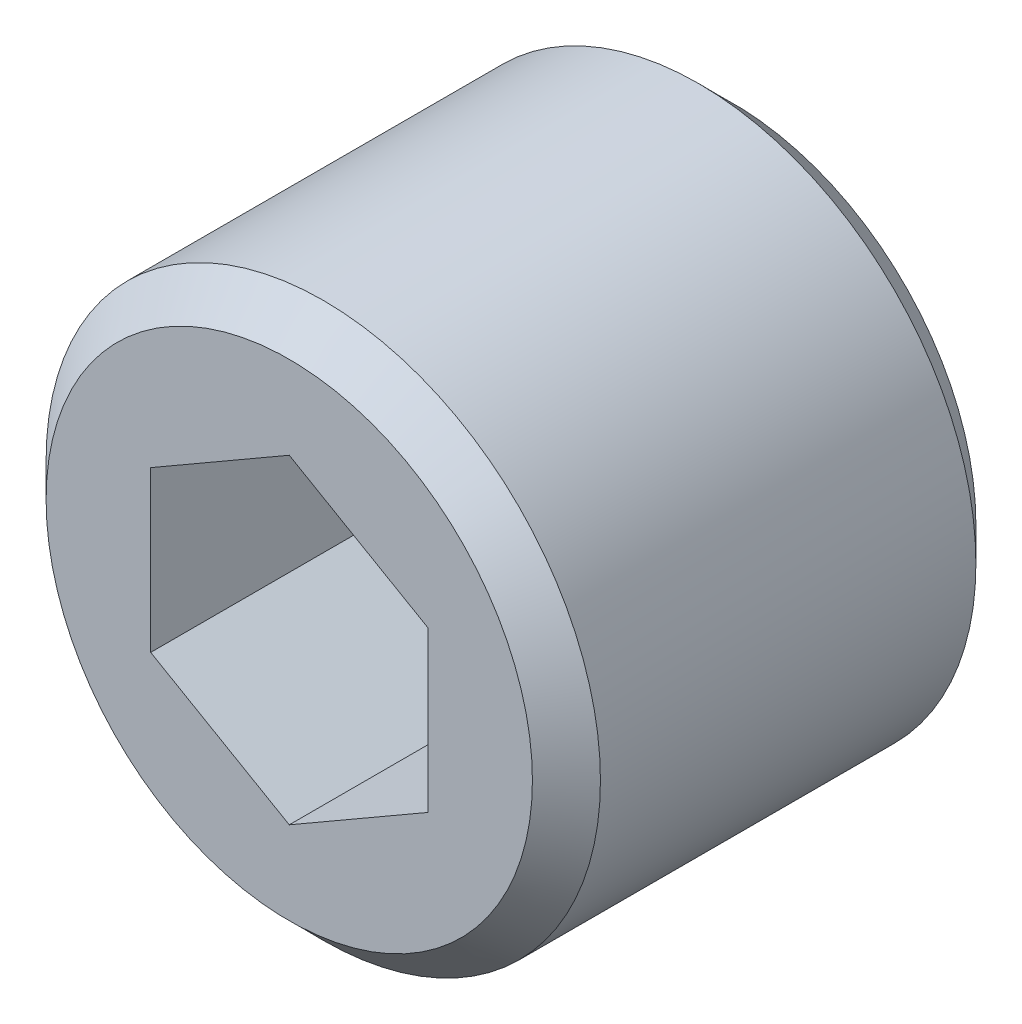
ISO-10303-21;
HEADER;
FILE_DESCRIPTION(('STEP AP214'),'2;1');
FILE_NAME('part.step','',(''),(''),'','','');
FILE_SCHEMA(('AUTOMOTIVE_DESIGN { 1 0 10303 214 1 1 1 1 }'));
ENDSEC;
DATA;
#1=APPLICATION_CONTEXT('core data for automotive mechanical design processes');
#2=APPLICATION_PROTOCOL_DEFINITION('international standard','automotive_design',2000,#1);
#3=PRODUCT_CONTEXT('',#1,'mechanical');
#4=PRODUCT('Part','Part','',(#3));
#5=PRODUCT_RELATED_PRODUCT_CATEGORY('part','',(#4));
#6=PRODUCT_DEFINITION_FORMATION('','',#4);
#7=PRODUCT_DEFINITION_CONTEXT('part definition',#1,'design');
#8=PRODUCT_DEFINITION('design','',#6,#7);
#9=PRODUCT_DEFINITION_SHAPE('','',#8);
#10=(LENGTH_UNIT() NAMED_UNIT(*) SI_UNIT(.MILLI.,.METRE.));
#11=(NAMED_UNIT(*) PLANE_ANGLE_UNIT() SI_UNIT($,.RADIAN.));
#12=(NAMED_UNIT(*) SI_UNIT($,.STERADIAN.) SOLID_ANGLE_UNIT());
#13=UNCERTAINTY_MEASURE_WITH_UNIT(LENGTH_MEASURE(1.E-05),#10,'distance_accuracy_value','');
#14=(GEOMETRIC_REPRESENTATION_CONTEXT(3) GLOBAL_UNCERTAINTY_ASSIGNED_CONTEXT((#13)) GLOBAL_UNIT_ASSIGNED_CONTEXT((#10,
#11,#12)) REPRESENTATION_CONTEXT('',''));
#15=CARTESIAN_POINT('',(0.,0.,0.));
#16=DIRECTION('',(0.,0.,1.));
#17=DIRECTION('',(1.,0.,0.));
#18=AXIS2_PLACEMENT_3D('',#15,#16,#17);
#19=CARTESIAN_POINT('',(0.,0.,8.));
#20=DIRECTION('',(0.,0.,-1.));
#21=DIRECTION('',(-1.,0.,0.));
#22=AXIS2_PLACEMENT_3D('',#19,#20,#21);
#23=PLANE('',#22);
#24=CARTESIAN_POINT('',(0.,0.,8.));
#25=DIRECTION('',(0.,0.,1.));
#26=DIRECTION('',(1.,0.,0.));
#27=AXIS2_PLACEMENT_3D('',#24,#25,#26);
#28=CIRCLE('',#27,4.3865);
#29=CARTESIAN_POINT('',(4.3865,0.,8.));
#30=VERTEX_POINT('',#29);
#31=EDGE_CURVE('E143',#30,#30,#28,.T.);
#32=ORIENTED_EDGE('',*,*,#31,.T.);
#33=EDGE_LOOP('',(#32));
#34=FACE_BOUND('',#33,.T.);
#35=DIRECTION('',(-0.866025403784439,-0.5,0.));
#36=VECTOR('',#35,1.);
#37=CARTESIAN_POINT('',(0.,2.88675134594813,8.));
#38=LINE('',#37,#36);
#39=CARTESIAN_POINT('',(0.,2.88675134594813,8.));
#40=VERTEX_POINT('',#39);
#41=CARTESIAN_POINT('',(-2.5,1.44337567297406,8.));
#42=VERTEX_POINT('',#41);
#43=EDGE_CURVE('E111',#40,#42,#38,.T.);
#44=ORIENTED_EDGE('',*,*,#43,.F.);
#45=DIRECTION('',(-0.866025403784439,0.5,0.));
#46=VECTOR('',#45,1.);
#47=CARTESIAN_POINT('',(2.5,1.44337567297406,8.));
#48=LINE('',#47,#46);
#49=CARTESIAN_POINT('',(2.5,1.44337567297406,8.));
#50=VERTEX_POINT('',#49);
#51=EDGE_CURVE('E123',#50,#40,#48,.T.);
#52=ORIENTED_EDGE('',*,*,#51,.F.);
#53=DIRECTION('',(0.,1.,0.));
#54=VECTOR('',#53,1.);
#55=CARTESIAN_POINT('',(2.5,-1.44337567297406,8.));
#56=LINE('',#55,#54);
#57=CARTESIAN_POINT('',(2.5,-1.44337567297406,8.));
#58=VERTEX_POINT('',#57);
#59=EDGE_CURVE('E117',#58,#50,#56,.T.);
#60=ORIENTED_EDGE('',*,*,#59,.F.);
#61=DIRECTION('',(0.866025403784439,0.5,0.));
#62=VECTOR('',#61,1.);
#63=CARTESIAN_POINT('',(0.,-2.88675134594813,8.));
#64=LINE('',#63,#62);
#65=CARTESIAN_POINT('',(0.,-2.88675134594813,8.));
#66=VERTEX_POINT('',#65);
#67=EDGE_CURVE('E115',#66,#58,#64,.T.);
#68=ORIENTED_EDGE('',*,*,#67,.F.);
#69=DIRECTION('',(0.866025403784439,-0.5,0.));
#70=VECTOR('',#69,1.);
#71=CARTESIAN_POINT('',(-2.5,-1.44337567297406,8.));
#72=LINE('',#71,#70);
#73=CARTESIAN_POINT('',(-2.5,-1.44337567297406,8.));
#74=VERTEX_POINT('',#73);
#75=EDGE_CURVE('E96',#74,#66,#72,.T.);
#76=ORIENTED_EDGE('',*,*,#75,.F.);
#77=DIRECTION('',(0.,-1.,0.));
#78=VECTOR('',#77,1.);
#79=CARTESIAN_POINT('',(-2.5,1.44337567297406,8.));
#80=LINE('',#79,#78);
#81=EDGE_CURVE('E105',#42,#74,#80,.T.);
#82=ORIENTED_EDGE('',*,*,#81,.F.);
#83=EDGE_LOOP('',(#44,#52,#60,#68,#76,#82));
#84=FACE_BOUND('',#83,.T.);
#85=ADVANCED_FACE('F37',(#34,#84),#23,.F.);
#86=CARTESIAN_POINT('',(0.,0.,7.3865));
#87=DIRECTION('',(0.,0.,-1.));
#88=DIRECTION('',(-1.,0.,0.));
#89=AXIS2_PLACEMENT_3D('',#86,#87,#88);
#90=CONICAL_SURFACE('',#89,5.,0.785398163397448);
#91=ORIENTED_EDGE('',*,*,#31,.F.);
#92=EDGE_LOOP('',(#91));
#93=FACE_BOUND('',#92,.T.);
#94=CARTESIAN_POINT('',(0.,0.,7.3865));
#95=DIRECTION('',(0.,0.,1.));
#96=DIRECTION('',(1.,0.,0.));
#97=AXIS2_PLACEMENT_3D('',#94,#95,#96);
#98=CIRCLE('',#97,5.);
#99=CARTESIAN_POINT('',(5.,0.,7.3865));
#100=VERTEX_POINT('',#99);
#101=EDGE_CURVE('E140',#100,#100,#98,.T.);
#102=ORIENTED_EDGE('',*,*,#101,.T.);
#103=EDGE_LOOP('',(#102));
#104=FACE_BOUND('',#103,.T.);
#105=ADVANCED_FACE('F205',(#93,#104),#90,.T.);
#106=CARTESIAN_POINT('',(0.,0.,0.));
#107=DIRECTION('',(0.,0.,1.));
#108=DIRECTION('',(1.,0.,0.));
#109=AXIS2_PLACEMENT_3D('',#106,#107,#108);
#110=CYLINDRICAL_SURFACE('',#109,5.);
#111=ORIENTED_EDGE('',*,*,#101,.F.);
#112=EDGE_LOOP('',(#111));
#113=FACE_BOUND('',#112,.T.);
#114=CARTESIAN_POINT('',(0.,0.,0.6135));
#115=DIRECTION('',(0.,0.,1.));
#116=DIRECTION('',(1.,0.,0.));
#117=AXIS2_PLACEMENT_3D('',#114,#115,#116);
#118=CIRCLE('',#117,5.);
#119=CARTESIAN_POINT('',(5.,0.,0.6135));
#120=VERTEX_POINT('',#119);
#121=EDGE_CURVE('E137',#120,#120,#118,.T.);
#122=ORIENTED_EDGE('',*,*,#121,.T.);
#123=EDGE_LOOP('',(#122));
#124=FACE_BOUND('',#123,.T.);
#125=ADVANCED_FACE('F210',(#113,#124),#110,.T.);
#126=CARTESIAN_POINT('',(0.,0.,0.));
#127=DIRECTION('',(0.,0.,1.));
#128=DIRECTION('',(1.,0.,0.));
#129=AXIS2_PLACEMENT_3D('',#126,#127,#128);
#130=CONICAL_SURFACE('',#129,4.3865,0.785398163397448);
#131=ORIENTED_EDGE('',*,*,#121,.F.);
#132=EDGE_LOOP('',(#131));
#133=FACE_BOUND('',#132,.T.);
#134=CARTESIAN_POINT('',(0.,0.,0.));
#135=DIRECTION('',(0.,0.,1.));
#136=DIRECTION('',(1.,0.,0.));
#137=AXIS2_PLACEMENT_3D('',#134,#135,#136);
#138=CIRCLE('',#137,4.3865);
#139=CARTESIAN_POINT('',(4.3865,0.,0.));
#140=VERTEX_POINT('',#139);
#141=EDGE_CURVE('E128',#140,#140,#138,.T.);
#142=ORIENTED_EDGE('',*,*,#141,.T.);
#143=EDGE_LOOP('',(#142));
#144=FACE_BOUND('',#143,.T.);
#145=ADVANCED_FACE('F218',(#133,#144),#130,.T.);
#146=CARTESIAN_POINT('',(0.,4.3865,0.));
#147=DIRECTION('',(0.,0.,1.));
#148=DIRECTION('',(1.,0.,0.));
#149=AXIS2_PLACEMENT_3D('',#146,#147,#148);
#150=PLANE('',#149);
#151=ORIENTED_EDGE('',*,*,#141,.F.);
#152=EDGE_LOOP('',(#151));
#153=FACE_BOUND('',#152,.T.);
#154=ADVANCED_FACE('F164',(#153),#150,.F.);
#155=CARTESIAN_POINT('',(0.,2.88675134594813,2.));
#156=DIRECTION('',(-0.5,0.866025403784439,0.));
#157=DIRECTION('',(-0.866025403784439,-0.5,0.));
#158=AXIS2_PLACEMENT_3D('',#155,#156,#157);
#159=PLANE('',#158);
#160=CARTESIAN_POINT('',(0.000200000000000067,2.88686681600197,3.71139153607169));
#161=CARTESIAN_POINT('',(-0.109663234734871,2.82343724785375,3.67475549182021));
#162=CARTESIAN_POINT('',(-0.220474799896526,2.75946016087834,3.64143609067764));
#163=CARTESIAN_POINT('',(-0.44401683346605,2.63039810762178,3.58327615727044));
#164=CARTESIAN_POINT('',(-0.556751274528388,2.5653108477275,3.55845620086032));
#165=CARTESIAN_POINT('',(-0.780822993875269,2.43594298024479,3.51981952315364));
#166=CARTESIAN_POINT('',(-0.892125791767377,2.37168227992023,3.50574566789822));
#167=CARTESIAN_POINT('',(-1.11525522746833,2.24285844015415,3.48894302406534));
#168=CARTESIAN_POINT('',(-1.22708105401423,2.17829576909552,3.48620032291621));
#169=CARTESIAN_POINT('',(-1.43604197555152,2.05765212479586,3.49189963172064));
#170=CARTESIAN_POINT('',(-1.53320831755773,2.0015531110824,3.49894226609445));
#171=CARTESIAN_POINT('',(-1.726907949711,1.88972057631678,3.52126529083753));
#172=CARTESIAN_POINT('',(-1.82344056965973,1.8339874422038,3.53655331015285));
#173=CARTESIAN_POINT('',(-2.01753972174048,1.7219242445005,3.57477296555701));
#174=CARTESIAN_POINT('',(-2.11508168178214,1.66560836761316,3.5978666478381));
#175=CARTESIAN_POINT('',(-2.30871060807609,1.55381665489446,3.6502805282905));
#176=CARTESIAN_POINT('',(-2.40480005588618,1.49833938633502,3.67958840733713));
#177=CARTESIAN_POINT('',(-2.5002,1.44326020292023,3.71139153607169));
#178=B_SPLINE_CURVE_WITH_KNOTS('',3,(#160,#161,#162,#163,#164,#165,#166,#167,#168,#169,#170,
#171,#172,#173,#174,#175,#176,#177),.UNSPECIFIED.,.F.,.F.,(4,2,2,2,2,2,2,2,4),(0.,
0.396285827362227,0.793524330152051,1.18093086852114,1.56786160134475,1.90479741793733,
2.24204551660463,2.58677531536756,2.93082800105256),.UNSPECIFIED.);
#179=CARTESIAN_POINT('',(0.,2.88675134594813,3.71132486540519));
#180=VERTEX_POINT('',#179);
#181=CARTESIAN_POINT('',(-2.5,1.44337567297406,3.71132486540519));
#182=VERTEX_POINT('',#181);
#183=EDGE_CURVE('E11',#180,#182,#178,.T.);
#184=ORIENTED_EDGE('',*,*,#183,.F.);
#185=DIRECTION('',(0.,0.,1.));
#186=VECTOR('',#185,1.);
#187=CARTESIAN_POINT('',(0.,2.88675134594813,2.));
#188=LINE('',#187,#186);
#189=EDGE_CURVE('E126',#180,#40,#188,.T.);
#190=ORIENTED_EDGE('',*,*,#189,.T.);
#191=ORIENTED_EDGE('',*,*,#43,.T.);
#192=DIRECTION('',(0.,0.,1.));
#193=VECTOR('',#192,1.);
#194=CARTESIAN_POINT('',(-2.5,1.44337567297406,2.));
#195=LINE('',#194,#193);
#196=EDGE_CURVE('E102',#182,#42,#195,.T.);
#197=ORIENTED_EDGE('',*,*,#196,.F.);
#198=EDGE_LOOP('',(#184,#190,#191,#197));
#199=FACE_BOUND('',#198,.T.);
#200=ADVANCED_FACE('F162',(#199),#159,.F.);
#201=CARTESIAN_POINT('',(2.5,1.44337567297406,2.));
#202=DIRECTION('',(0.5,0.866025403784439,0.));
#203=DIRECTION('',(-0.866025403784439,0.5,0.));
#204=AXIS2_PLACEMENT_3D('',#201,#202,#203);
#205=PLANE('',#204);
#206=CARTESIAN_POINT('',(2.5002,1.44326020292023,3.71139153607169));
#207=CARTESIAN_POINT('',(2.39033676526513,1.50668977106845,3.67475549182021));
#208=CARTESIAN_POINT('',(2.27952520010347,1.57066685804385,3.64143609067764));
#209=CARTESIAN_POINT('',(2.05598316653395,1.69972891130041,3.58327615727044));
#210=CARTESIAN_POINT('',(1.94324872547161,1.7648161711947,3.55845620086032));
#211=CARTESIAN_POINT('',(1.71917700612473,1.8941840386774,3.51981952315364));
#212=CARTESIAN_POINT('',(1.60787420823262,1.95844473900197,3.50574566789822));
#213=CARTESIAN_POINT('',(1.38474477253167,2.08726857876804,3.48894302406534));
#214=CARTESIAN_POINT('',(1.27291894598577,2.15183124982667,3.48620032291621));
#215=CARTESIAN_POINT('',(1.06395802444848,2.27247489412634,3.49189963172064));
#216=CARTESIAN_POINT('',(0.966791682442269,2.32857390783979,3.49894226609445));
#217=CARTESIAN_POINT('',(0.773092050288998,2.44040644260542,3.52126529083753));
#218=CARTESIAN_POINT('',(0.676559430340268,2.4961395767184,3.53655331015285));
#219=CARTESIAN_POINT('',(0.482460278259524,2.60820277442169,3.57477296555701));
#220=CARTESIAN_POINT('',(0.38491831821786,2.66451865130903,3.5978666478381));
#221=CARTESIAN_POINT('',(0.191289391923915,2.77631036402774,3.6502805282905));
#222=CARTESIAN_POINT('',(0.0951999441138242,2.83178763258717,3.67958840733713));
#223=CARTESIAN_POINT('',(-0.000199999999999825,2.88686681600197,3.71139153607169));
#224=B_SPLINE_CURVE_WITH_KNOTS('',3,(#206,#207,#208,#209,#210,#211,#212,#213,#214,#215,#216,
#217,#218,#219,#220,#221,#222,#223),.UNSPECIFIED.,.F.,.F.,(4,2,2,2,2,2,2,2,4),(0.,
0.396285827362227,0.793524330152051,1.18093086852114,1.56786160134475,1.90479741793733,
2.24204551660463,2.58677531536756,2.93082800105256),.UNSPECIFIED.);
#225=CARTESIAN_POINT('',(2.5,1.44337567297406,3.71132486540519));
#226=VERTEX_POINT('',#225);
#227=EDGE_CURVE('E49',#226,#180,#224,.T.);
#228=ORIENTED_EDGE('',*,*,#227,.F.);
#229=DIRECTION('',(0.,0.,1.));
#230=VECTOR('',#229,1.);
#231=CARTESIAN_POINT('',(2.5,1.44337567297406,2.));
#232=LINE('',#231,#230);
#233=EDGE_CURVE('E129',#226,#50,#232,.T.);
#234=ORIENTED_EDGE('',*,*,#233,.T.);
#235=ORIENTED_EDGE('',*,*,#51,.T.);
#236=ORIENTED_EDGE('',*,*,#189,.F.);
#237=EDGE_LOOP('',(#228,#234,#235,#236));
#238=FACE_BOUND('',#237,.T.);
#239=ADVANCED_FACE('F187',(#238),#205,.F.);
#240=CARTESIAN_POINT('',(2.5,-1.44337567297406,2.));
#241=DIRECTION('',(1.,0.,0.));
#242=DIRECTION('',(0.,0.,-1.));
#243=AXIS2_PLACEMENT_3D('',#240,#241,#242);
#244=PLANE('',#243);
#245=CARTESIAN_POINT('',(2.5,-3.80354536274311,4.6725190097687));
#246=CARTESIAN_POINT('',(2.5,-3.69490769832015,4.62012023042167));
#247=CARTESIAN_POINT('',(2.5,-3.58601249619524,4.56824581898817));
#248=CARTESIAN_POINT('',(2.5,-3.36756967184562,4.46584239469188));
#249=CARTESIAN_POINT('',(2.5,-3.2580219427232,4.4153136101271));
#250=CARTESIAN_POINT('',(2.5,-3.03753650963653,4.31562808504963));
#251=CARTESIAN_POINT('',(2.5,-2.92659442987774,4.26648098792461));
#252=CARTESIAN_POINT('',(2.5,-2.7038011769608,4.17030036779373));
#253=CARTESIAN_POINT('',(2.5,-2.59195004950777,4.12326673929366));
#254=CARTESIAN_POINT('',(2.5,-2.36393185858999,4.03056111042707));
#255=CARTESIAN_POINT('',(2.5,-2.24773301175535,3.98496683977699));
#256=CARTESIAN_POINT('',(2.5,-2.01394925265267,3.89741057847115));
#257=CARTESIAN_POINT('',(2.5,-1.89636418294698,3.85544900499669));
#258=CARTESIAN_POINT('',(2.5,-1.6598655692674,3.7763133461035));
#259=CARTESIAN_POINT('',(2.5,-1.54095552400517,3.73912891396282));
#260=CARTESIAN_POINT('',(2.5,-1.30143267945433,3.6707883675403));
#261=CARTESIAN_POINT('',(2.5,-1.1808204524229,3.63963027673055));
#262=CARTESIAN_POINT('',(2.5,-0.938435603689883,3.5850354250525));
#263=CARTESIAN_POINT('',(2.5,-0.816671313996666,3.56156237346552));
#264=CARTESIAN_POINT('',(2.5,-0.571709789783548,3.52372921743801));
#265=CARTESIAN_POINT('',(2.5,-0.448512677134953,3.50936834363467));
#266=CARTESIAN_POINT('',(2.5,-0.202876939190632,3.4910936303705));
#267=CARTESIAN_POINT('',(2.5,-0.0804481107207811,3.48705132366934));
#268=CARTESIAN_POINT('',(2.5,0.164317684086213,3.48942250548384));
#269=CARTESIAN_POINT('',(2.5,0.286654645471647,3.49583652207227));
#270=CARTESIAN_POINT('',(2.5,0.496536810226146,3.5153685716693));
#271=CARTESIAN_POINT('',(2.5,0.584312886733857,3.52613135091325));
#272=CARTESIAN_POINT('',(2.5,0.759169937557936,3.55232907680575));
#273=CARTESIAN_POINT('',(2.5,0.846250806407076,3.56776471903351));
#274=CARTESIAN_POINT('',(2.5,1.10635948095145,3.62026382491819));
#275=CARTESIAN_POINT('',(2.5,1.27815072711483,3.66350870557406));
#276=CARTESIAN_POINT('',(2.5,1.53506550284549,3.73785728454145));
#277=CARTESIAN_POINT('',(2.5,1.62153366246677,3.76457321086045));
#278=CARTESIAN_POINT('',(2.5,1.79362861993971,3.82061377036906));
#279=CARTESIAN_POINT('',(2.5,1.87925541165719,3.84993842256249));
#280=CARTESIAN_POINT('',(2.5,2.04969958535049,3.91073954546207));
#281=CARTESIAN_POINT('',(2.5,2.13451724990374,3.9422152310642));
#282=CARTESIAN_POINT('',(2.5,2.30345957057387,4.00696464665995));
#283=CARTESIAN_POINT('',(2.5,2.38758423990774,4.04023834226953));
#284=CARTESIAN_POINT('',(2.5,2.60850926228513,4.12990700014006));
#285=CARTESIAN_POINT('',(2.5,2.74480078798769,4.18755420672217));
#286=CARTESIAN_POINT('',(2.5,3.01608258252838,4.30584276869593));
#287=CARTESIAN_POINT('',(2.5,3.15107273452449,4.366484389999));
#288=CARTESIAN_POINT('',(2.5,3.42004027276287,4.4900648230423));
#289=CARTESIAN_POINT('',(2.5,3.55401736356482,4.5530042759084));
#290=CARTESIAN_POINT('',(2.5,3.82112684724773,4.68065374226447));
#291=CARTESIAN_POINT('',(2.5,3.95425921865227,4.74536380055044));
#292=CARTESIAN_POINT('',(2.5,4.35298879056563,4.94173197564146));
#293=CARTESIAN_POINT('',(2.5,4.61756415208986,5.07546265144789));
#294=CARTESIAN_POINT('',(2.5,5.14484341868587,5.34643093420089));
#295=CARTESIAN_POINT('',(2.5,5.40754763258291,5.48366794444604));
#296=CARTESIAN_POINT('',(2.5,5.90549486968664,5.74672244622175));
#297=CARTESIAN_POINT('',(2.5,6.14085909655125,5.87231087888962));
#298=CARTESIAN_POINT('',(2.5,6.61082917058931,6.12492462252423));
#299=CARTESIAN_POINT('',(2.5,6.845434979194,6.25195000513267));
#300=CARTESIAN_POINT('',(2.5,7.31339853832471,6.50671020920538));
#301=CARTESIAN_POINT('',(2.5,7.54675794150776,6.63444199834073));
#302=CARTESIAN_POINT('',(2.5,8.01300328003957,6.89073099781081));
#303=CARTESIAN_POINT('',(2.5,8.24588924545531,7.01928815342598));
#304=CARTESIAN_POINT('',(2.5,8.47860728564428,7.14814659734655));
#305=B_SPLINE_CURVE_WITH_KNOTS('',3,(#245,#246,#247,#248,#249,#250,#251,#252,#253,#254,#255,
#256,#257,#258,#259,#260,#261,#262,#263,#264,#265,#266,#267,#268,#269,#270,#271,#272,#273,#274,
#275,#276,#277,#278,#279,#280,#281,#282,#283,#284,#285,#286,#287,#288,#289,#290,#291,#292,#293,
#294,#295,#296,#297,#298,#299,#300,#301,#302,#303,#304),.UNSPECIFIED.,.F.,.F.,(4,2,2,2,2,2,2,2,
2,2,2,2,2,2,2,2,2,2,2,2,2,2,2,2,2,2,2,2,2,4),(0.,0.361847268785331,0.723755542157358,
1.08776024821181,1.45174676466692,1.82617161351042,2.20063940466463,2.57428195574295,
2.94780175042321,3.31953135659565,3.6912295725766,4.05827702149836,4.42534300788945,
4.69051350042857,4.95572348435735,5.48645163926355,5.75793466631763,6.02941967121232,
6.30080611083378,6.57218736246452,7.01607948416826,7.46001109572594,7.904067531252,
8.34813521173141,9.23744336378662,10.1266011700445,10.9269186624072,11.727276233433,
12.5253647133932,13.3234008176414),.UNSPECIFIED.);
#306=CARTESIAN_POINT('',(2.5,-1.44337567297406,3.71132486540519));
#307=VERTEX_POINT('',#306);
#308=EDGE_CURVE('E177',#307,#226,#305,.T.);
#309=ORIENTED_EDGE('',*,*,#308,.F.);
#310=DIRECTION('',(0.,0.,1.));
#311=VECTOR('',#310,1.);
#312=CARTESIAN_POINT('',(2.5,-1.44337567297406,2.));
#313=LINE('',#312,#311);
#314=EDGE_CURVE('E131',#307,#58,#313,.T.);
#315=ORIENTED_EDGE('',*,*,#314,.T.);
#316=ORIENTED_EDGE('',*,*,#59,.T.);
#317=ORIENTED_EDGE('',*,*,#233,.F.);
#318=EDGE_LOOP('',(#309,#315,#316,#317));
#319=FACE_BOUND('',#318,.T.);
#320=ADVANCED_FACE('F190',(#319),#244,.F.);
#321=CARTESIAN_POINT('',(0.,-2.88675134594813,2.));
#322=DIRECTION('',(0.5,-0.866025403784439,0.));
#323=DIRECTION('',(0.866025403784439,0.5,0.));
#324=AXIS2_PLACEMENT_3D('',#321,#322,#323);
#325=PLANE('',#324);
#326=CARTESIAN_POINT('',(-0.000200000000000067,-2.88686681600197,3.71139153607169));
#327=CARTESIAN_POINT('',(0.109663234734871,-2.82343724785375,3.67475549182021));
#328=CARTESIAN_POINT('',(0.220474799896526,-2.75946016087834,3.64143609067764));
#329=CARTESIAN_POINT('',(0.44401683346605,-2.63039810762178,3.58327615727044));
#330=CARTESIAN_POINT('',(0.556751274528388,-2.5653108477275,3.55845620086032));
#331=CARTESIAN_POINT('',(0.780822993875269,-2.43594298024479,3.51981952315364));
#332=CARTESIAN_POINT('',(0.892125791767377,-2.37168227992023,3.50574566789822));
#333=CARTESIAN_POINT('',(1.11525522746833,-2.24285844015415,3.48894302406534));
#334=CARTESIAN_POINT('',(1.22708105401423,-2.17829576909552,3.48620032291621));
#335=CARTESIAN_POINT('',(1.43604197555152,-2.05765212479586,3.49189963172064));
#336=CARTESIAN_POINT('',(1.53320831755773,-2.0015531110824,3.49894226609445));
#337=CARTESIAN_POINT('',(1.726907949711,-1.88972057631678,3.52126529083753));
#338=CARTESIAN_POINT('',(1.82344056965973,-1.8339874422038,3.53655331015285));
#339=CARTESIAN_POINT('',(2.01753972174048,-1.7219242445005,3.57477296555701));
#340=CARTESIAN_POINT('',(2.11508168178214,-1.66560836761316,3.5978666478381));
#341=CARTESIAN_POINT('',(2.30871060807609,-1.55381665489446,3.6502805282905));
#342=CARTESIAN_POINT('',(2.40480005588618,-1.49833938633502,3.67958840733713));
#343=CARTESIAN_POINT('',(2.5002,-1.44326020292023,3.71139153607169));
#344=B_SPLINE_CURVE_WITH_KNOTS('',3,(#326,#327,#328,#329,#330,#331,#332,#333,#334,#335,#336,
#337,#338,#339,#340,#341,#342,#343),.UNSPECIFIED.,.F.,.F.,(4,2,2,2,2,2,2,2,4),(0.,
0.396285827362227,0.793524330152051,1.18093086852114,1.56786160134475,1.90479741793733,
2.24204551660463,2.58677531536756,2.93082800105256),.UNSPECIFIED.);
#345=CARTESIAN_POINT('',(0.,-2.88675134594813,3.71132486540519));
#346=VERTEX_POINT('',#345);
#347=EDGE_CURVE('E171',#346,#307,#344,.T.);
#348=ORIENTED_EDGE('',*,*,#347,.F.);
#349=DIRECTION('',(0.,0.,1.));
#350=VECTOR('',#349,1.);
#351=CARTESIAN_POINT('',(0.,-2.88675134594813,2.));
#352=LINE('',#351,#350);
#353=EDGE_CURVE('E101',#346,#66,#352,.T.);
#354=ORIENTED_EDGE('',*,*,#353,.T.);
#355=ORIENTED_EDGE('',*,*,#67,.T.);
#356=ORIENTED_EDGE('',*,*,#314,.F.);
#357=EDGE_LOOP('',(#348,#354,#355,#356));
#358=FACE_BOUND('',#357,.T.);
#359=ADVANCED_FACE('F194',(#358),#325,.F.);
#360=CARTESIAN_POINT('',(-2.5,-1.44337567297406,2.));
#361=DIRECTION('',(-0.5,-0.866025403784439,0.));
#362=DIRECTION('',(0.866025403784439,-0.5,0.));
#363=AXIS2_PLACEMENT_3D('',#360,#361,#362);
#364=PLANE('',#363);
#365=CARTESIAN_POINT('',(-2.5002,-1.44326020292023,3.71139153607169));
#366=CARTESIAN_POINT('',(-2.39033676526513,-1.50668977106845,3.67475549182021));
#367=CARTESIAN_POINT('',(-2.27952520010347,-1.57066685804385,3.64143609067764));
#368=CARTESIAN_POINT('',(-2.05598316653395,-1.69972891130041,3.58327615727044));
#369=CARTESIAN_POINT('',(-1.94324872547161,-1.7648161711947,3.55845620086032));
#370=CARTESIAN_POINT('',(-1.71917700612473,-1.8941840386774,3.51981952315364));
#371=CARTESIAN_POINT('',(-1.60787420823262,-1.95844473900197,3.50574566789822));
#372=CARTESIAN_POINT('',(-1.38474477253167,-2.08726857876804,3.48894302406534));
#373=CARTESIAN_POINT('',(-1.27291894598577,-2.15183124982667,3.48620032291621));
#374=CARTESIAN_POINT('',(-1.06395802444848,-2.27247489412634,3.49189963172064));
#375=CARTESIAN_POINT('',(-0.966791682442269,-2.32857390783979,3.49894226609445));
#376=CARTESIAN_POINT('',(-0.773092050288998,-2.44040644260542,3.52126529083753));
#377=CARTESIAN_POINT('',(-0.676559430340268,-2.4961395767184,3.53655331015285));
#378=CARTESIAN_POINT('',(-0.482460278259524,-2.60820277442169,3.57477296555701));
#379=CARTESIAN_POINT('',(-0.38491831821786,-2.66451865130903,3.5978666478381));
#380=CARTESIAN_POINT('',(-0.191289391923915,-2.77631036402774,3.6502805282905));
#381=CARTESIAN_POINT('',(-0.0951999441138242,-2.83178763258717,3.67958840733713));
#382=CARTESIAN_POINT('',(0.000199999999999825,-2.88686681600197,3.71139153607169));
#383=B_SPLINE_CURVE_WITH_KNOTS('',3,(#365,#366,#367,#368,#369,#370,#371,#372,#373,#374,#375,
#376,#377,#378,#379,#380,#381,#382),.UNSPECIFIED.,.F.,.F.,(4,2,2,2,2,2,2,2,4),(0.,
0.396285827362227,0.793524330152051,1.18093086852114,1.56786160134475,1.90479741793733,
2.24204551660463,2.58677531536756,2.93082800105256),.UNSPECIFIED.);
#384=CARTESIAN_POINT('',(-2.5,-1.4433756729755,3.71132486540421));
#385=VERTEX_POINT('',#384);
#386=EDGE_CURVE('E99',#385,#346,#383,.T.);
#387=ORIENTED_EDGE('',*,*,#386,.F.);
#388=DIRECTION('',(0.,0.,1.));
#389=VECTOR('',#388,1.);
#390=CARTESIAN_POINT('',(-2.5,-1.44337567297406,2.));
#391=LINE('',#390,#389);
#392=EDGE_CURVE('E56',#385,#74,#391,.T.);
#393=ORIENTED_EDGE('',*,*,#392,.T.);
#394=ORIENTED_EDGE('',*,*,#75,.T.);
#395=ORIENTED_EDGE('',*,*,#353,.F.);
#396=EDGE_LOOP('',(#387,#393,#394,#395));
#397=FACE_BOUND('',#396,.T.);
#398=ADVANCED_FACE('F93',(#397),#364,.F.);
#399=CARTESIAN_POINT('',(-2.5,1.44337567297406,2.));
#400=DIRECTION('',(-1.,0.,0.));
#401=DIRECTION('',(0.,0.,1.));
#402=AXIS2_PLACEMENT_3D('',#399,#400,#401);
#403=PLANE('',#402);
#404=CARTESIAN_POINT('',(-2.5,-3.80354536274311,4.6725190097687));
#405=CARTESIAN_POINT('',(-2.5,-3.69490769832015,4.62012023042167));
#406=CARTESIAN_POINT('',(-2.5,-3.58601249619524,4.56824581898817));
#407=CARTESIAN_POINT('',(-2.5,-3.36756967184562,4.46584239469188));
#408=CARTESIAN_POINT('',(-2.5,-3.2580219427232,4.4153136101271));
#409=CARTESIAN_POINT('',(-2.5,-3.03753650963653,4.31562808504963));
#410=CARTESIAN_POINT('',(-2.5,-2.92659442987774,4.26648098792461));
#411=CARTESIAN_POINT('',(-2.5,-2.7038011769608,4.17030036779373));
#412=CARTESIAN_POINT('',(-2.5,-2.59195004950777,4.12326673929366));
#413=CARTESIAN_POINT('',(-2.5,-2.36393185858999,4.03056111042707));
#414=CARTESIAN_POINT('',(-2.5,-2.24773301175535,3.98496683977699));
#415=CARTESIAN_POINT('',(-2.5,-2.01394925265267,3.89741057847115));
#416=CARTESIAN_POINT('',(-2.5,-1.89636418294698,3.85544900499669));
#417=CARTESIAN_POINT('',(-2.5,-1.6598655692674,3.7763133461035));
#418=CARTESIAN_POINT('',(-2.5,-1.54095552400517,3.73912891396282));
#419=CARTESIAN_POINT('',(-2.5,-1.30143267945433,3.6707883675403));
#420=CARTESIAN_POINT('',(-2.5,-1.1808204524229,3.63963027673055));
#421=CARTESIAN_POINT('',(-2.5,-0.938435603689883,3.5850354250525));
#422=CARTESIAN_POINT('',(-2.5,-0.816671313996666,3.56156237346552));
#423=CARTESIAN_POINT('',(-2.5,-0.571709789783548,3.52372921743801));
#424=CARTESIAN_POINT('',(-2.5,-0.448512677134953,3.50936834363467));
#425=CARTESIAN_POINT('',(-2.5,-0.202876939190632,3.4910936303705));
#426=CARTESIAN_POINT('',(-2.5,-0.0804481107207811,3.48705132366934));
#427=CARTESIAN_POINT('',(-2.5,0.164317684086213,3.48942250548384));
#428=CARTESIAN_POINT('',(-2.5,0.286654645471647,3.49583652207227));
#429=CARTESIAN_POINT('',(-2.5,0.496536810226146,3.5153685716693));
#430=CARTESIAN_POINT('',(-2.5,0.584312886733857,3.52613135091325));
#431=CARTESIAN_POINT('',(-2.5,0.759169937557936,3.55232907680575));
#432=CARTESIAN_POINT('',(-2.5,0.846250806407076,3.56776471903351));
#433=CARTESIAN_POINT('',(-2.5,1.10635948095145,3.62026382491819));
#434=CARTESIAN_POINT('',(-2.5,1.27815072711483,3.66350870557406));
#435=CARTESIAN_POINT('',(-2.5,1.53506550284549,3.73785728454145));
#436=CARTESIAN_POINT('',(-2.5,1.62153366246677,3.76457321086045));
#437=CARTESIAN_POINT('',(-2.5,1.79362861993971,3.82061377036906));
#438=CARTESIAN_POINT('',(-2.5,1.87925541165719,3.84993842256249));
#439=CARTESIAN_POINT('',(-2.5,2.04969958535049,3.91073954546207));
#440=CARTESIAN_POINT('',(-2.5,2.13451724990374,3.9422152310642));
#441=CARTESIAN_POINT('',(-2.5,2.30345957057387,4.00696464665995));
#442=CARTESIAN_POINT('',(-2.5,2.38758423990774,4.04023834226953));
#443=CARTESIAN_POINT('',(-2.5,2.60850926228513,4.12990700014006));
#444=CARTESIAN_POINT('',(-2.5,2.74480078798769,4.18755420672217));
#445=CARTESIAN_POINT('',(-2.5,3.01608258252838,4.30584276869593));
#446=CARTESIAN_POINT('',(-2.5,3.15107273452449,4.366484389999));
#447=CARTESIAN_POINT('',(-2.5,3.42004027276287,4.4900648230423));
#448=CARTESIAN_POINT('',(-2.5,3.55401736356482,4.5530042759084));
#449=CARTESIAN_POINT('',(-2.5,3.82112684724773,4.68065374226447));
#450=CARTESIAN_POINT('',(-2.5,3.95425921865227,4.74536380055044));
#451=CARTESIAN_POINT('',(-2.5,4.35298879056563,4.94173197564146));
#452=CARTESIAN_POINT('',(-2.5,4.61756415208986,5.07546265144789));
#453=CARTESIAN_POINT('',(-2.5,5.14484341868587,5.34643093420089));
#454=CARTESIAN_POINT('',(-2.5,5.40754763258291,5.48366794444604));
#455=CARTESIAN_POINT('',(-2.5,5.90549486968664,5.74672244622175));
#456=CARTESIAN_POINT('',(-2.5,6.14085909655125,5.87231087888962));
#457=CARTESIAN_POINT('',(-2.5,6.61082917058931,6.12492462252423));
#458=CARTESIAN_POINT('',(-2.5,6.845434979194,6.25195000513267));
#459=CARTESIAN_POINT('',(-2.5,7.31339853832471,6.50671020920538));
#460=CARTESIAN_POINT('',(-2.5,7.54675794150776,6.63444199834073));
#461=CARTESIAN_POINT('',(-2.5,8.01300328003957,6.89073099781081));
#462=CARTESIAN_POINT('',(-2.5,8.24588924545531,7.01928815342598));
#463=CARTESIAN_POINT('',(-2.5,8.47860728564428,7.14814659734655));
#464=B_SPLINE_CURVE_WITH_KNOTS('',3,(#404,#405,#406,#407,#408,#409,#410,#411,#412,#413,#414,
#415,#416,#417,#418,#419,#420,#421,#422,#423,#424,#425,#426,#427,#428,#429,#430,#431,#432,#433,
#434,#435,#436,#437,#438,#439,#440,#441,#442,#443,#444,#445,#446,#447,#448,#449,#450,#451,#452,
#453,#454,#455,#456,#457,#458,#459,#460,#461,#462,#463),.UNSPECIFIED.,.F.,.F.,(4,2,2,2,2,2,2,2,
2,2,2,2,2,2,2,2,2,2,2,2,2,2,2,2,2,2,2,2,2,4),(0.,0.361847268785331,0.723755542157358,
1.08776024821181,1.45174676466692,1.82617161351042,2.20063940466463,2.57428195574295,
2.94780175042321,3.31953135659565,3.6912295725766,4.05827702149836,4.42534300788945,
4.69051350042857,4.95572348435735,5.48645163926355,5.75793466631763,6.02941967121232,
6.30080611083378,6.57218736246452,7.01607948416826,7.46001109572594,7.904067531252,
8.34813521173141,9.23744336378662,10.1266011700445,10.9269186624072,11.727276233433,
12.5253647133932,13.3234008176414),.UNSPECIFIED.);
#465=EDGE_CURVE('E146',#182,#385,#464,.F.);
#466=ORIENTED_EDGE('',*,*,#465,.F.);
#467=ORIENTED_EDGE('',*,*,#196,.T.);
#468=ORIENTED_EDGE('',*,*,#81,.T.);
#469=ORIENTED_EDGE('',*,*,#392,.F.);
#470=EDGE_LOOP('',(#466,#467,#468,#469));
#471=FACE_BOUND('',#470,.T.);
#472=ADVANCED_FACE('F106',(#471),#403,.F.);
#473=CARTESIAN_POINT('',(0.,0.,2.04465819873852));
#474=DIRECTION('',(0.,0.,1.));
#475=DIRECTION('',(1.,0.,0.));
#476=AXIS2_PLACEMENT_3D('',#473,#474,#475);
#477=CONICAL_SURFACE('',#476,0.,1.0471975511966);
#478=CARTESIAN_POINT('',(0.,0.,2.04465819873852));
#479=VERTEX_POINT('',#478);
#480=VERTEX_LOOP('',#479);
#481=FACE_BOUND('',#480,.T.);
#482=ORIENTED_EDGE('',*,*,#227,.T.);
#483=ORIENTED_EDGE('',*,*,#183,.T.);
#484=ORIENTED_EDGE('',*,*,#465,.T.);
#485=ORIENTED_EDGE('',*,*,#386,.T.);
#486=ORIENTED_EDGE('',*,*,#347,.T.);
#487=ORIENTED_EDGE('',*,*,#308,.T.);
#488=EDGE_LOOP('',(#482,#483,#484,#485,#486,#487));
#489=FACE_BOUND('',#488,.T.);
#490=ADVANCED_FACE('F158',(#481,#489),#477,.F.);
#491=CLOSED_SHELL('',(#85,#105,#125,#145,#154,#200,#239,#320,#359,#398,#472,#490));
#492=MANIFOLD_SOLID_BREP('B2',#491);
#493=ADVANCED_BREP_SHAPE_REPRESENTATION('',(#18,#492),#14);
#494=SHAPE_DEFINITION_REPRESENTATION(#9,#493);
ENDSEC;
END-ISO-10303-21;
